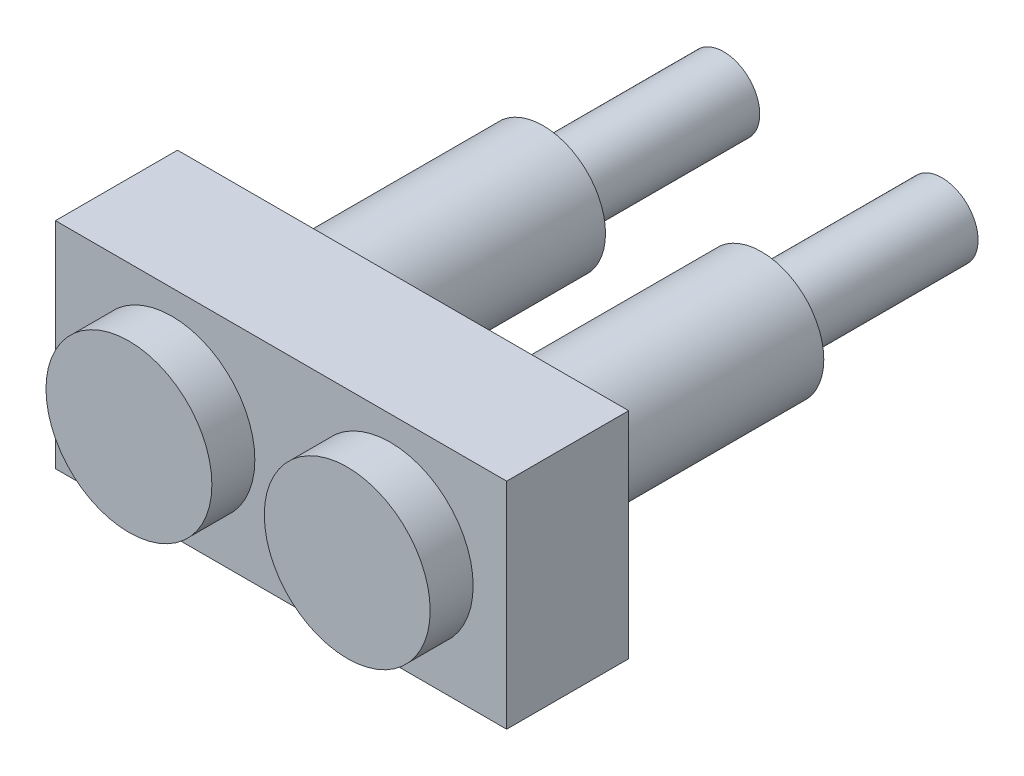
ISO-10303-21;
HEADER;
FILE_DESCRIPTION(('STEP AP214'),'2;1');
FILE_NAME('part.step','',(''),(''),'','','');
FILE_SCHEMA(('AUTOMOTIVE_DESIGN { 1 0 10303 214 1 1 1 1 }'));
ENDSEC;
DATA;
#1=APPLICATION_CONTEXT('core data for automotive mechanical design processes');
#2=APPLICATION_PROTOCOL_DEFINITION('international standard','automotive_design',2000,#1);
#3=PRODUCT_CONTEXT('',#1,'mechanical');
#4=PRODUCT('Part','Part','',(#3));
#5=PRODUCT_RELATED_PRODUCT_CATEGORY('part','',(#4));
#6=PRODUCT_DEFINITION_FORMATION('','',#4);
#7=PRODUCT_DEFINITION_CONTEXT('part definition',#1,'design');
#8=PRODUCT_DEFINITION('design','',#6,#7);
#9=PRODUCT_DEFINITION_SHAPE('','',#8);
#10=(LENGTH_UNIT() NAMED_UNIT(*) SI_UNIT(.MILLI.,.METRE.));
#11=(NAMED_UNIT(*) PLANE_ANGLE_UNIT() SI_UNIT($,.RADIAN.));
#12=(NAMED_UNIT(*) SI_UNIT($,.STERADIAN.) SOLID_ANGLE_UNIT());
#13=UNCERTAINTY_MEASURE_WITH_UNIT(LENGTH_MEASURE(1.E-05),#10,'distance_accuracy_value','');
#14=(GEOMETRIC_REPRESENTATION_CONTEXT(3) GLOBAL_UNCERTAINTY_ASSIGNED_CONTEXT((#13)) GLOBAL_UNIT_ASSIGNED_CONTEXT((#10,
#11,#12)) REPRESENTATION_CONTEXT('',''));
#15=CARTESIAN_POINT('',(0.,0.,0.));
#16=DIRECTION('',(0.,0.,1.));
#17=DIRECTION('',(1.,0.,0.));
#18=AXIS2_PLACEMENT_3D('',#15,#16,#17);
#19=CARTESIAN_POINT('',(1.27,0.,-5.));
#20=DIRECTION('',(0.,0.,1.));
#21=DIRECTION('',(1.,0.,0.));
#22=AXIS2_PLACEMENT_3D('',#19,#20,#21);
#23=CYLINDRICAL_SURFACE('',#22,0.725);
#24=CARTESIAN_POINT('',(1.27,0.,0.));
#25=DIRECTION('',(0.,0.,1.));
#26=DIRECTION('',(1.,0.,0.));
#27=AXIS2_PLACEMENT_3D('',#24,#25,#26);
#28=CIRCLE('',#27,0.725);
#29=CARTESIAN_POINT('',(1.995,0.,0.));
#30=VERTEX_POINT('',#29);
#31=EDGE_CURVE('E44',#30,#30,#28,.F.);
#32=ORIENTED_EDGE('',*,*,#31,.T.);
#33=EDGE_LOOP('',(#32));
#34=FACE_BOUND('',#33,.T.);
#35=CARTESIAN_POINT('',(1.27,0.,-2.9));
#36=DIRECTION('',(0.,0.,-1.));
#37=DIRECTION('',(-1.,0.,0.));
#38=AXIS2_PLACEMENT_3D('',#35,#36,#37);
#39=CIRCLE('',#38,0.725);
#40=CARTESIAN_POINT('',(0.545,0.,-2.9));
#41=VERTEX_POINT('',#40);
#42=EDGE_CURVE('E194',#41,#41,#39,.T.);
#43=ORIENTED_EDGE('',*,*,#42,.F.);
#44=EDGE_LOOP('',(#43));
#45=FACE_BOUND('',#44,.T.);
#46=ADVANCED_FACE('F35',(#34,#45),#23,.T.);
#47=CARTESIAN_POINT('',(-1.27,0.,-5.));
#48=DIRECTION('',(0.,0.,1.));
#49=DIRECTION('',(1.,0.,0.));
#50=AXIS2_PLACEMENT_3D('',#47,#48,#49);
#51=CYLINDRICAL_SURFACE('',#50,0.725);
#52=CARTESIAN_POINT('',(-1.27,0.,0.));
#53=DIRECTION('',(0.,0.,1.));
#54=DIRECTION('',(1.,0.,0.));
#55=AXIS2_PLACEMENT_3D('',#52,#53,#54);
#56=CIRCLE('',#55,0.725);
#57=CARTESIAN_POINT('',(-0.545,0.,0.));
#58=VERTEX_POINT('',#57);
#59=EDGE_CURVE('E11',#58,#58,#56,.F.);
#60=ORIENTED_EDGE('',*,*,#59,.T.);
#61=EDGE_LOOP('',(#60));
#62=FACE_BOUND('',#61,.T.);
#63=CARTESIAN_POINT('',(-1.27,0.,-2.9));
#64=DIRECTION('',(0.,0.,-1.));
#65=DIRECTION('',(-1.,0.,0.));
#66=AXIS2_PLACEMENT_3D('',#63,#64,#65);
#67=CIRCLE('',#66,0.725);
#68=CARTESIAN_POINT('',(-1.995,0.,-2.9));
#69=VERTEX_POINT('',#68);
#70=EDGE_CURVE('E192',#69,#69,#67,.T.);
#71=ORIENTED_EDGE('',*,*,#70,.F.);
#72=EDGE_LOOP('',(#71));
#73=FACE_BOUND('',#72,.T.);
#74=ADVANCED_FACE('F136',(#62,#73),#51,.T.);
#75=CARTESIAN_POINT('',(-2.625,-1.25,1.42));
#76=DIRECTION('',(1.,0.,0.));
#77=DIRECTION('',(0.,0.,-1.));
#78=AXIS2_PLACEMENT_3D('',#75,#76,#77);
#79=PLANE('',#78);
#80=DIRECTION('',(0.,-1.,0.));
#81=VECTOR('',#80,1.);
#82=CARTESIAN_POINT('',(-2.625,-1.25,0.));
#83=LINE('',#82,#81);
#84=CARTESIAN_POINT('',(-2.625,1.25,0.));
#85=VERTEX_POINT('',#84);
#86=CARTESIAN_POINT('',(-2.625,-1.25,0.));
#87=VERTEX_POINT('',#86);
#88=EDGE_CURVE('E103',#85,#87,#83,.T.);
#89=ORIENTED_EDGE('',*,*,#88,.T.);
#90=DIRECTION('',(0.,0.,-1.));
#91=VECTOR('',#90,1.);
#92=CARTESIAN_POINT('',(-2.625,-1.25,1.42));
#93=LINE('',#92,#91);
#94=CARTESIAN_POINT('',(-2.625,-1.25,1.42));
#95=VERTEX_POINT('',#94);
#96=EDGE_CURVE('E94',#95,#87,#93,.T.);
#97=ORIENTED_EDGE('',*,*,#96,.F.);
#98=DIRECTION('',(0.,-1.,0.));
#99=VECTOR('',#98,1.);
#100=CARTESIAN_POINT('',(-2.625,-1.25,1.42));
#101=LINE('',#100,#99);
#102=CARTESIAN_POINT('',(-2.625,1.25,1.42));
#103=VERTEX_POINT('',#102);
#104=EDGE_CURVE('E88',#103,#95,#101,.T.);
#105=ORIENTED_EDGE('',*,*,#104,.F.);
#106=DIRECTION('',(0.,0.,-1.));
#107=VECTOR('',#106,1.);
#108=CARTESIAN_POINT('',(-2.625,1.25,1.42));
#109=LINE('',#108,#107);
#110=EDGE_CURVE('E99',#103,#85,#109,.T.);
#111=ORIENTED_EDGE('',*,*,#110,.T.);
#112=EDGE_LOOP('',(#89,#97,#105,#111));
#113=FACE_BOUND('',#112,.T.);
#114=ADVANCED_FACE('F37',(#113),#79,.F.);
#115=CARTESIAN_POINT('',(2.625,-1.25,1.42));
#116=DIRECTION('',(0.,1.,0.));
#117=DIRECTION('',(-1.,0.,0.));
#118=AXIS2_PLACEMENT_3D('',#115,#116,#117);
#119=PLANE('',#118);
#120=DIRECTION('',(1.,0.,0.));
#121=VECTOR('',#120,1.);
#122=CARTESIAN_POINT('',(2.625,-1.25,0.));
#123=LINE('',#122,#121);
#124=CARTESIAN_POINT('',(2.625,-1.25,0.));
#125=VERTEX_POINT('',#124);
#126=EDGE_CURVE('E93',#87,#125,#123,.T.);
#127=ORIENTED_EDGE('',*,*,#126,.T.);
#128=DIRECTION('',(0.,0.,-1.));
#129=VECTOR('',#128,1.);
#130=CARTESIAN_POINT('',(2.625,-1.25,1.42));
#131=LINE('',#130,#129);
#132=CARTESIAN_POINT('',(2.625,-1.25,1.42));
#133=VERTEX_POINT('',#132);
#134=EDGE_CURVE('E91',#133,#125,#131,.T.);
#135=ORIENTED_EDGE('',*,*,#134,.F.);
#136=DIRECTION('',(1.,0.,0.));
#137=VECTOR('',#136,1.);
#138=CARTESIAN_POINT('',(2.625,-1.25,1.42));
#139=LINE('',#138,#137);
#140=EDGE_CURVE('E83',#95,#133,#139,.T.);
#141=ORIENTED_EDGE('',*,*,#140,.F.);
#142=ORIENTED_EDGE('',*,*,#96,.T.);
#143=EDGE_LOOP('',(#127,#135,#141,#142));
#144=FACE_BOUND('',#143,.T.);
#145=ADVANCED_FACE('F92',(#144),#119,.F.);
#146=CARTESIAN_POINT('',(2.625,-1.25,1.42));
#147=DIRECTION('',(-1.,0.,0.));
#148=DIRECTION('',(0.,0.,1.));
#149=AXIS2_PLACEMENT_3D('',#146,#147,#148);
#150=PLANE('',#149);
#151=DIRECTION('',(0.,1.,0.));
#152=VECTOR('',#151,1.);
#153=CARTESIAN_POINT('',(2.625,-1.25,0.));
#154=LINE('',#153,#152);
#155=CARTESIAN_POINT('',(2.625,1.25,0.));
#156=VERTEX_POINT('',#155);
#157=EDGE_CURVE('E69',#125,#156,#154,.T.);
#158=ORIENTED_EDGE('',*,*,#157,.T.);
#159=DIRECTION('',(0.,0.,-1.));
#160=VECTOR('',#159,1.);
#161=CARTESIAN_POINT('',(2.625,1.25,1.42));
#162=LINE('',#161,#160);
#163=CARTESIAN_POINT('',(2.625,1.25,1.42));
#164=VERTEX_POINT('',#163);
#165=EDGE_CURVE('E95',#164,#156,#162,.T.);
#166=ORIENTED_EDGE('',*,*,#165,.F.);
#167=DIRECTION('',(0.,1.,0.));
#168=VECTOR('',#167,1.);
#169=CARTESIAN_POINT('',(2.625,-1.25,1.42));
#170=LINE('',#169,#168);
#171=EDGE_CURVE('E86',#133,#164,#170,.T.);
#172=ORIENTED_EDGE('',*,*,#171,.F.);
#173=ORIENTED_EDGE('',*,*,#134,.T.);
#174=EDGE_LOOP('',(#158,#166,#172,#173));
#175=FACE_BOUND('',#174,.T.);
#176=ADVANCED_FACE('F97',(#175),#150,.F.);
#177=CARTESIAN_POINT('',(2.625,1.25,1.42));
#178=DIRECTION('',(0.,-1.,0.));
#179=DIRECTION('',(1.,0.,0.));
#180=AXIS2_PLACEMENT_3D('',#177,#178,#179);
#181=PLANE('',#180);
#182=DIRECTION('',(-1.,0.,0.));
#183=VECTOR('',#182,1.);
#184=CARTESIAN_POINT('',(2.625,1.25,0.));
#185=LINE('',#184,#183);
#186=EDGE_CURVE('E75',#156,#85,#185,.T.);
#187=ORIENTED_EDGE('',*,*,#186,.T.);
#188=ORIENTED_EDGE('',*,*,#110,.F.);
#189=DIRECTION('',(-1.,0.,0.));
#190=VECTOR('',#189,1.);
#191=CARTESIAN_POINT('',(2.625,1.25,1.42));
#192=LINE('',#191,#190);
#193=EDGE_CURVE('E52',#164,#103,#192,.T.);
#194=ORIENTED_EDGE('',*,*,#193,.F.);
#195=ORIENTED_EDGE('',*,*,#165,.T.);
#196=EDGE_LOOP('',(#187,#188,#194,#195));
#197=FACE_BOUND('',#196,.T.);
#198=ADVANCED_FACE('F125',(#197),#181,.F.);
#199=CARTESIAN_POINT('',(0.,0.,1.42));
#200=DIRECTION('',(0.,0.,1.));
#201=DIRECTION('',(1.,0.,0.));
#202=AXIS2_PLACEMENT_3D('',#199,#200,#201);
#203=PLANE('',#202);
#204=CARTESIAN_POINT('',(1.27,0.,1.42));
#205=DIRECTION('',(0.,0.,1.));
#206=DIRECTION('',(1.,0.,0.));
#207=AXIS2_PLACEMENT_3D('',#204,#205,#206);
#208=CIRCLE('',#207,0.965);
#209=CARTESIAN_POINT('',(2.235,0.,1.42));
#210=VERTEX_POINT('',#209);
#211=EDGE_CURVE('E202',#210,#210,#208,.T.);
#212=ORIENTED_EDGE('',*,*,#211,.F.);
#213=EDGE_LOOP('',(#212));
#214=FACE_BOUND('',#213,.T.);
#215=CARTESIAN_POINT('',(-1.27,0.,1.42));
#216=DIRECTION('',(0.,0.,1.));
#217=DIRECTION('',(1.,0.,0.));
#218=AXIS2_PLACEMENT_3D('',#215,#216,#217);
#219=CIRCLE('',#218,0.965);
#220=CARTESIAN_POINT('',(-0.305,0.,1.42));
#221=VERTEX_POINT('',#220);
#222=EDGE_CURVE('E211',#221,#221,#219,.T.);
#223=ORIENTED_EDGE('',*,*,#222,.F.);
#224=EDGE_LOOP('',(#223));
#225=FACE_BOUND('',#224,.T.);
#226=ORIENTED_EDGE('',*,*,#104,.T.);
#227=ORIENTED_EDGE('',*,*,#140,.T.);
#228=ORIENTED_EDGE('',*,*,#171,.T.);
#229=ORIENTED_EDGE('',*,*,#193,.T.);
#230=EDGE_LOOP('',(#226,#227,#228,#229));
#231=FACE_BOUND('',#230,.T.);
#232=ADVANCED_FACE('F84',(#214,#225,#231),#203,.T.);
#233=CARTESIAN_POINT('',(0.,0.,0.));
#234=DIRECTION('',(0.,0.,1.));
#235=DIRECTION('',(1.,0.,0.));
#236=AXIS2_PLACEMENT_3D('',#233,#234,#235);
#237=PLANE('',#236);
#238=ORIENTED_EDGE('',*,*,#59,.F.);
#239=EDGE_LOOP('',(#238));
#240=FACE_BOUND('',#239,.T.);
#241=ORIENTED_EDGE('',*,*,#31,.F.);
#242=EDGE_LOOP('',(#241));
#243=FACE_BOUND('',#242,.T.);
#244=ORIENTED_EDGE('',*,*,#88,.F.);
#245=ORIENTED_EDGE('',*,*,#186,.F.);
#246=ORIENTED_EDGE('',*,*,#157,.F.);
#247=ORIENTED_EDGE('',*,*,#126,.F.);
#248=EDGE_LOOP('',(#244,#245,#246,#247));
#249=FACE_BOUND('',#248,.T.);
#250=ADVANCED_FACE('F117',(#240,#243,#249),#237,.F.);
#251=CARTESIAN_POINT('',(-1.27,0.,1.92));
#252=DIRECTION('',(0.,0.,-1.));
#253=DIRECTION('',(-1.,0.,0.));
#254=AXIS2_PLACEMENT_3D('',#251,#252,#253);
#255=CYLINDRICAL_SURFACE('',#254,0.965);
#256=CARTESIAN_POINT('',(-1.27,0.,1.92));
#257=DIRECTION('',(0.,0.,1.));
#258=DIRECTION('',(1.,0.,0.));
#259=AXIS2_PLACEMENT_3D('',#256,#257,#258);
#260=CIRCLE('',#259,0.965);
#261=CARTESIAN_POINT('',(-0.305,0.,1.92));
#262=VERTEX_POINT('',#261);
#263=EDGE_CURVE('E106',#262,#262,#260,.T.);
#264=ORIENTED_EDGE('',*,*,#263,.F.);
#265=EDGE_LOOP('',(#264));
#266=FACE_BOUND('',#265,.T.);
#267=ORIENTED_EDGE('',*,*,#222,.T.);
#268=EDGE_LOOP('',(#267));
#269=FACE_BOUND('',#268,.T.);
#270=ADVANCED_FACE('F120',(#266,#269),#255,.T.);
#271=CARTESIAN_POINT('',(-1.27,0.,1.92));
#272=DIRECTION('',(0.,0.,1.));
#273=DIRECTION('',(1.,0.,0.));
#274=AXIS2_PLACEMENT_3D('',#271,#272,#273);
#275=PLANE('',#274);
#276=ORIENTED_EDGE('',*,*,#263,.T.);
#277=EDGE_LOOP('',(#276));
#278=FACE_BOUND('',#277,.T.);
#279=ADVANCED_FACE('F156',(#278),#275,.T.);
#280=CARTESIAN_POINT('',(1.27,0.,1.92));
#281=DIRECTION('',(0.,0.,-1.));
#282=DIRECTION('',(-1.,0.,0.));
#283=AXIS2_PLACEMENT_3D('',#280,#281,#282);
#284=CYLINDRICAL_SURFACE('',#283,0.965);
#285=CARTESIAN_POINT('',(1.27,0.,1.92));
#286=DIRECTION('',(0.,0.,1.));
#287=DIRECTION('',(1.,0.,0.));
#288=AXIS2_PLACEMENT_3D('',#285,#286,#287);
#289=CIRCLE('',#288,0.965);
#290=CARTESIAN_POINT('',(2.235,0.,1.92));
#291=VERTEX_POINT('',#290);
#292=EDGE_CURVE('E208',#291,#291,#289,.T.);
#293=ORIENTED_EDGE('',*,*,#292,.F.);
#294=EDGE_LOOP('',(#293));
#295=FACE_BOUND('',#294,.T.);
#296=ORIENTED_EDGE('',*,*,#211,.T.);
#297=EDGE_LOOP('',(#296));
#298=FACE_BOUND('',#297,.T.);
#299=ADVANCED_FACE('F160',(#295,#298),#284,.T.);
#300=CARTESIAN_POINT('',(1.27,0.,1.92));
#301=DIRECTION('',(0.,0.,1.));
#302=DIRECTION('',(1.,0.,0.));
#303=AXIS2_PLACEMENT_3D('',#300,#301,#302);
#304=PLANE('',#303);
#305=ORIENTED_EDGE('',*,*,#292,.T.);
#306=EDGE_LOOP('',(#305));
#307=FACE_BOUND('',#306,.T.);
#308=ADVANCED_FACE('F164',(#307),#304,.T.);
#309=CARTESIAN_POINT('',(-1.27,0.,-2.9));
#310=DIRECTION('',(0.,0.,-1.));
#311=DIRECTION('',(-1.,0.,0.));
#312=AXIS2_PLACEMENT_3D('',#309,#310,#311);
#313=PLANE('',#312);
#314=CARTESIAN_POINT('',(-1.27,0.,-2.9));
#315=DIRECTION('',(0.,0.,-1.));
#316=DIRECTION('',(-1.,0.,0.));
#317=AXIS2_PLACEMENT_3D('',#314,#315,#316);
#318=CIRCLE('',#317,0.42);
#319=CARTESIAN_POINT('',(-1.69,0.,-2.9));
#320=VERTEX_POINT('',#319);
#321=EDGE_CURVE('E197',#320,#320,#318,.T.);
#322=ORIENTED_EDGE('',*,*,#321,.F.);
#323=EDGE_LOOP('',(#322));
#324=FACE_BOUND('',#323,.T.);
#325=ORIENTED_EDGE('',*,*,#70,.T.);
#326=EDGE_LOOP('',(#325));
#327=FACE_BOUND('',#326,.T.);
#328=ADVANCED_FACE('F168',(#324,#327),#313,.T.);
#329=CARTESIAN_POINT('',(-1.27,0.,-2.9));
#330=DIRECTION('',(0.,0.,-1.));
#331=DIRECTION('',(-1.,0.,0.));
#332=AXIS2_PLACEMENT_3D('',#329,#330,#331);
#333=CYLINDRICAL_SURFACE('',#332,0.42);
#334=ORIENTED_EDGE('',*,*,#321,.T.);
#335=EDGE_LOOP('',(#334));
#336=FACE_BOUND('',#335,.T.);
#337=CARTESIAN_POINT('',(-1.27,0.,-5.));
#338=DIRECTION('',(0.,0.,-1.));
#339=DIRECTION('',(-1.,0.,0.));
#340=AXIS2_PLACEMENT_3D('',#337,#338,#339);
#341=CIRCLE('',#340,0.42);
#342=CARTESIAN_POINT('',(-1.69,0.,-5.));
#343=VERTEX_POINT('',#342);
#344=EDGE_CURVE('E205',#343,#343,#341,.T.);
#345=ORIENTED_EDGE('',*,*,#344,.F.);
#346=EDGE_LOOP('',(#345));
#347=FACE_BOUND('',#346,.T.);
#348=ADVANCED_FACE('F172',(#336,#347),#333,.T.);
#349=CARTESIAN_POINT('',(1.27,0.,-2.9));
#350=DIRECTION('',(0.,0.,-1.));
#351=DIRECTION('',(-1.,0.,0.));
#352=AXIS2_PLACEMENT_3D('',#349,#350,#351);
#353=PLANE('',#352);
#354=CARTESIAN_POINT('',(1.27,0.,-2.9));
#355=DIRECTION('',(0.,0.,-1.));
#356=DIRECTION('',(-1.,0.,0.));
#357=AXIS2_PLACEMENT_3D('',#354,#355,#356);
#358=CIRCLE('',#357,0.42);
#359=CARTESIAN_POINT('',(0.85,0.,-2.9));
#360=VERTEX_POINT('',#359);
#361=EDGE_CURVE('E188',#360,#360,#358,.T.);
#362=ORIENTED_EDGE('',*,*,#361,.F.);
#363=EDGE_LOOP('',(#362));
#364=FACE_BOUND('',#363,.T.);
#365=ORIENTED_EDGE('',*,*,#42,.T.);
#366=EDGE_LOOP('',(#365));
#367=FACE_BOUND('',#366,.T.);
#368=ADVANCED_FACE('F176',(#364,#367),#353,.T.);
#369=CARTESIAN_POINT('',(1.27,0.,-2.9));
#370=DIRECTION('',(0.,0.,-1.));
#371=DIRECTION('',(-1.,0.,0.));
#372=AXIS2_PLACEMENT_3D('',#369,#370,#371);
#373=CYLINDRICAL_SURFACE('',#372,0.42);
#374=ORIENTED_EDGE('',*,*,#361,.T.);
#375=EDGE_LOOP('',(#374));
#376=FACE_BOUND('',#375,.T.);
#377=CARTESIAN_POINT('',(1.27,0.,-5.));
#378=DIRECTION('',(0.,0.,-1.));
#379=DIRECTION('',(-1.,0.,0.));
#380=AXIS2_PLACEMENT_3D('',#377,#378,#379);
#381=CIRCLE('',#380,0.42);
#382=CARTESIAN_POINT('',(0.85,0.,-5.));
#383=VERTEX_POINT('',#382);
#384=EDGE_CURVE('E191',#383,#383,#381,.T.);
#385=ORIENTED_EDGE('',*,*,#384,.F.);
#386=EDGE_LOOP('',(#385));
#387=FACE_BOUND('',#386,.T.);
#388=ADVANCED_FACE('F152',(#376,#387),#373,.T.);
#389=CARTESIAN_POINT('',(-1.27,0.,-5.));
#390=DIRECTION('',(0.,0.,1.));
#391=DIRECTION('',(1.,0.,0.));
#392=AXIS2_PLACEMENT_3D('',#389,#390,#391);
#393=PLANE('',#392);
#394=ORIENTED_EDGE('',*,*,#344,.T.);
#395=EDGE_LOOP('',(#394));
#396=FACE_BOUND('',#395,.T.);
#397=ADVANCED_FACE('F147',(#396),#393,.F.);
#398=CARTESIAN_POINT('',(1.27,0.,-5.));
#399=DIRECTION('',(0.,0.,-1.));
#400=DIRECTION('',(-1.,0.,0.));
#401=AXIS2_PLACEMENT_3D('',#398,#399,#400);
#402=PLANE('',#401);
#403=ORIENTED_EDGE('',*,*,#384,.T.);
#404=EDGE_LOOP('',(#403));
#405=FACE_BOUND('',#404,.T.);
#406=ADVANCED_FACE('F145',(#405),#402,.T.);
#407=CLOSED_SHELL('',(#46,#74,#114,#145,#176,#198,#232,#250,#270,#279,#299,#308,#328,#348,#368,
#388,#397,#406));
#408=MANIFOLD_SOLID_BREP('B2',#407);
#409=ADVANCED_BREP_SHAPE_REPRESENTATION('',(#18,#408),#14);
#410=SHAPE_DEFINITION_REPRESENTATION(#9,#409);
ENDSEC;
END-ISO-10303-21;
